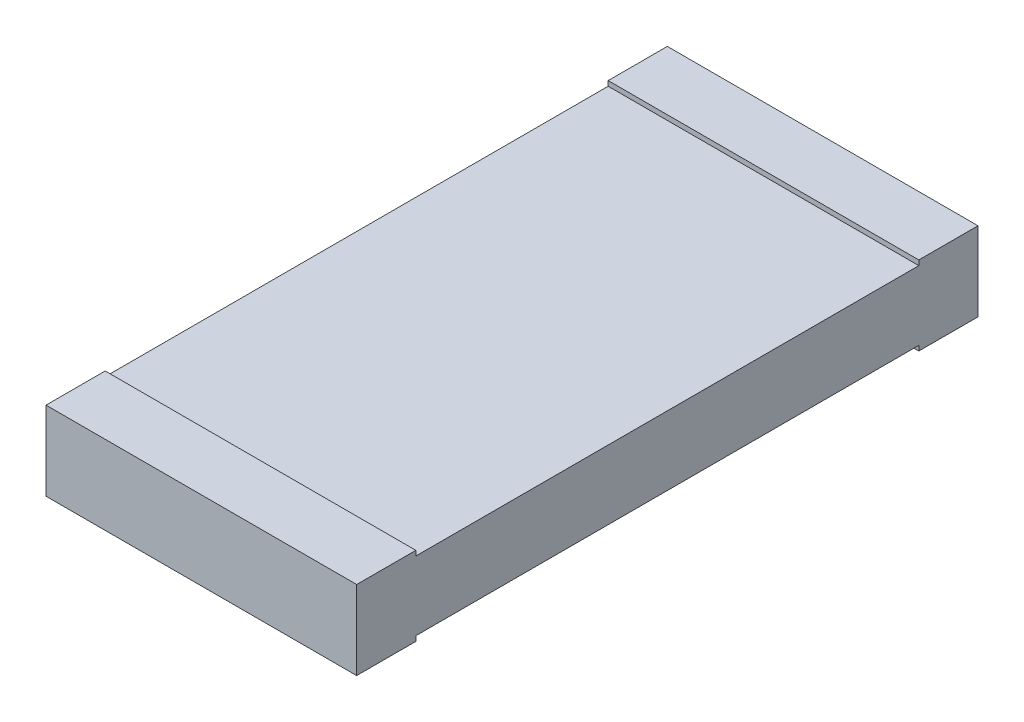
ISO-10303-21;
HEADER;
FILE_DESCRIPTION(('STEP AP214'),'2;1');
FILE_NAME('part.step','',(''),(''),'','','');
FILE_SCHEMA(('AUTOMOTIVE_DESIGN { 1 0 10303 214 1 1 1 1 }'));
ENDSEC;
DATA;
#1=APPLICATION_CONTEXT('core data for automotive mechanical design processes');
#2=APPLICATION_PROTOCOL_DEFINITION('international standard','automotive_design',2000,#1);
#3=PRODUCT_CONTEXT('',#1,'mechanical');
#4=PRODUCT('Part','Part','',(#3));
#5=PRODUCT_RELATED_PRODUCT_CATEGORY('part','',(#4));
#6=PRODUCT_DEFINITION_FORMATION('','',#4);
#7=PRODUCT_DEFINITION_CONTEXT('part definition',#1,'design');
#8=PRODUCT_DEFINITION('design','',#6,#7);
#9=PRODUCT_DEFINITION_SHAPE('','',#8);
#10=(LENGTH_UNIT() NAMED_UNIT(*) SI_UNIT(.MILLI.,.METRE.));
#11=(NAMED_UNIT(*) PLANE_ANGLE_UNIT() SI_UNIT($,.RADIAN.));
#12=(NAMED_UNIT(*) SI_UNIT($,.STERADIAN.) SOLID_ANGLE_UNIT());
#13=UNCERTAINTY_MEASURE_WITH_UNIT(LENGTH_MEASURE(1.E-05),#10,'distance_accuracy_value','');
#14=(GEOMETRIC_REPRESENTATION_CONTEXT(3) GLOBAL_UNCERTAINTY_ASSIGNED_CONTEXT((#13)) GLOBAL_UNIT_ASSIGNED_CONTEXT((#10,
#11,#12)) REPRESENTATION_CONTEXT('',''));
#15=CARTESIAN_POINT('',(0.,0.,0.));
#16=DIRECTION('',(0.,0.,1.));
#17=DIRECTION('',(1.,0.,0.));
#18=AXIS2_PLACEMENT_3D('',#15,#16,#17);
#19=CARTESIAN_POINT('',(-1.575,0.,3.15));
#20=DIRECTION('',(0.,1.,0.));
#21=DIRECTION('',(0.,0.,1.));
#22=AXIS2_PLACEMENT_3D('',#19,#20,#21);
#23=PLANE('',#22);
#24=DIRECTION('',(-1.,0.,0.));
#25=VECTOR('',#24,1.);
#26=CARTESIAN_POINT('',(-1.575,0.,-2.55));
#27=LINE('',#26,#25);
#28=CARTESIAN_POINT('',(1.575,0.,-2.55));
#29=VERTEX_POINT('',#28);
#30=CARTESIAN_POINT('',(-1.575,0.,-2.55));
#31=VERTEX_POINT('',#30);
#32=EDGE_CURVE('E149',#29,#31,#27,.T.);
#33=ORIENTED_EDGE('',*,*,#32,.T.);
#34=DIRECTION('',(0.,0.,1.));
#35=VECTOR('',#34,1.);
#36=CARTESIAN_POINT('',(-1.575,0.,3.15));
#37=LINE('',#36,#35);
#38=CARTESIAN_POINT('',(-1.575,0.,-3.15));
#39=VERTEX_POINT('',#38);
#40=EDGE_CURVE('E20',#39,#31,#37,.T.);
#41=ORIENTED_EDGE('',*,*,#40,.F.);
#42=DIRECTION('',(1.,0.,0.));
#43=VECTOR('',#42,1.);
#44=CARTESIAN_POINT('',(-1.575,0.,-3.15));
#45=LINE('',#44,#43);
#46=CARTESIAN_POINT('',(1.575,0.,-3.15));
#47=VERTEX_POINT('',#46);
#48=EDGE_CURVE('E155',#39,#47,#45,.T.);
#49=ORIENTED_EDGE('',*,*,#48,.T.);
#50=DIRECTION('',(0.,0.,1.));
#51=VECTOR('',#50,1.);
#52=CARTESIAN_POINT('',(1.575,0.,3.15));
#53=LINE('',#52,#51);
#54=EDGE_CURVE('E134',#29,#47,#53,.F.);
#55=ORIENTED_EDGE('',*,*,#54,.F.);
#56=EDGE_LOOP('',(#33,#41,#49,#55));
#57=FACE_BOUND('',#56,.T.);
#58=ADVANCED_FACE('F17',(#57),#23,.F.);
#59=CARTESIAN_POINT('',(-1.575,0.,3.15));
#60=DIRECTION('',(0.,1.,0.));
#61=DIRECTION('',(0.,0.,1.));
#62=AXIS2_PLACEMENT_3D('',#59,#60,#61);
#63=PLANE('',#62);
#64=DIRECTION('',(1.,0.,0.));
#65=VECTOR('',#64,1.);
#66=CARTESIAN_POINT('',(-1.575,0.,2.55));
#67=LINE('',#66,#65);
#68=CARTESIAN_POINT('',(-1.575,0.,2.55));
#69=VERTEX_POINT('',#68);
#70=CARTESIAN_POINT('',(1.575,0.,2.55));
#71=VERTEX_POINT('',#70);
#72=EDGE_CURVE('E160',#69,#71,#67,.T.);
#73=ORIENTED_EDGE('',*,*,#72,.T.);
#74=DIRECTION('',(0.,0.,1.));
#75=VECTOR('',#74,1.);
#76=CARTESIAN_POINT('',(1.575,0.,3.15));
#77=LINE('',#76,#75);
#78=CARTESIAN_POINT('',(1.575,0.,3.15));
#79=VERTEX_POINT('',#78);
#80=EDGE_CURVE('E102',#79,#71,#77,.F.);
#81=ORIENTED_EDGE('',*,*,#80,.F.);
#82=DIRECTION('',(-1.,0.,0.));
#83=VECTOR('',#82,1.);
#84=CARTESIAN_POINT('',(-1.575,0.,3.15));
#85=LINE('',#84,#83);
#86=CARTESIAN_POINT('',(-1.575,0.,3.15));
#87=VERTEX_POINT('',#86);
#88=EDGE_CURVE('E111',#79,#87,#85,.T.);
#89=ORIENTED_EDGE('',*,*,#88,.T.);
#90=DIRECTION('',(0.,0.,1.));
#91=VECTOR('',#90,1.);
#92=CARTESIAN_POINT('',(-1.575,0.,3.15));
#93=LINE('',#92,#91);
#94=EDGE_CURVE('E117',#69,#87,#93,.T.);
#95=ORIENTED_EDGE('',*,*,#94,.F.);
#96=EDGE_LOOP('',(#73,#81,#89,#95));
#97=FACE_BOUND('',#96,.T.);
#98=ADVANCED_FACE('F125',(#97),#63,.F.);
#99=CARTESIAN_POINT('',(-1.575,0.8,3.15));
#100=DIRECTION('',(0.,0.,-1.));
#101=DIRECTION('',(-1.,0.,0.));
#102=AXIS2_PLACEMENT_3D('',#99,#100,#101);
#103=PLANE('',#102);
#104=DIRECTION('',(0.,1.,0.));
#105=VECTOR('',#104,1.);
#106=CARTESIAN_POINT('',(1.575,0.8,3.15));
#107=LINE('',#106,#105);
#108=CARTESIAN_POINT('',(1.575,0.8,3.15));
#109=VERTEX_POINT('',#108);
#110=EDGE_CURVE('E116',#109,#79,#107,.F.);
#111=ORIENTED_EDGE('',*,*,#110,.F.);
#112=DIRECTION('',(1.,0.,0.));
#113=VECTOR('',#112,1.);
#114=CARTESIAN_POINT('',(-1.575,0.8,3.15));
#115=LINE('',#114,#113);
#116=CARTESIAN_POINT('',(-1.575,0.8,3.15));
#117=VERTEX_POINT('',#116);
#118=EDGE_CURVE('E114',#117,#109,#115,.T.);
#119=ORIENTED_EDGE('',*,*,#118,.F.);
#120=DIRECTION('',(0.,1.,0.));
#121=VECTOR('',#120,1.);
#122=CARTESIAN_POINT('',(-1.575,0.8,3.15));
#123=LINE('',#122,#121);
#124=EDGE_CURVE('E108',#87,#117,#123,.T.);
#125=ORIENTED_EDGE('',*,*,#124,.F.);
#126=ORIENTED_EDGE('',*,*,#88,.F.);
#127=EDGE_LOOP('',(#111,#119,#125,#126));
#128=FACE_BOUND('',#127,.T.);
#129=ADVANCED_FACE('F110',(#128),#103,.F.);
#130=CARTESIAN_POINT('',(-1.575,0.8,-3.15));
#131=DIRECTION('',(0.,0.,1.));
#132=DIRECTION('',(1.,0.,0.));
#133=AXIS2_PLACEMENT_3D('',#130,#131,#132);
#134=PLANE('',#133);
#135=DIRECTION('',(0.,1.,0.));
#136=VECTOR('',#135,1.);
#137=CARTESIAN_POINT('',(-1.575,0.8,-3.15));
#138=LINE('',#137,#136);
#139=CARTESIAN_POINT('',(-1.575,0.8,-3.15));
#140=VERTEX_POINT('',#139);
#141=EDGE_CURVE('E129',#140,#39,#138,.F.);
#142=ORIENTED_EDGE('',*,*,#141,.F.);
#143=DIRECTION('',(1.,0.,0.));
#144=VECTOR('',#143,1.);
#145=CARTESIAN_POINT('',(-1.575,0.8,-3.15));
#146=LINE('',#145,#144);
#147=CARTESIAN_POINT('',(1.575,0.8,-3.15));
#148=VERTEX_POINT('',#147);
#149=EDGE_CURVE('E172',#148,#140,#146,.F.);
#150=ORIENTED_EDGE('',*,*,#149,.F.);
#151=DIRECTION('',(0.,1.,0.));
#152=VECTOR('',#151,1.);
#153=CARTESIAN_POINT('',(1.575,0.8,-3.15));
#154=LINE('',#153,#152);
#155=EDGE_CURVE('E126',#47,#148,#154,.T.);
#156=ORIENTED_EDGE('',*,*,#155,.F.);
#157=ORIENTED_EDGE('',*,*,#48,.F.);
#158=EDGE_LOOP('',(#142,#150,#156,#157));
#159=FACE_BOUND('',#158,.T.);
#160=ADVANCED_FACE('F256',(#159),#134,.F.);
#161=CARTESIAN_POINT('',(-1.575,-0.319521140078355,-2.55));
#162=DIRECTION('',(0.,0.,-1.));
#163=DIRECTION('',(-1.,0.,0.));
#164=AXIS2_PLACEMENT_3D('',#161,#162,#163);
#165=PLANE('',#164);
#166=DIRECTION('',(1.,0.,0.));
#167=VECTOR('',#166,1.);
#168=CARTESIAN_POINT('',(-1.575,0.0500000000000006,-2.55));
#169=LINE('',#168,#167);
#170=CARTESIAN_POINT('',(1.575,0.0500000000000007,-2.55));
#171=VERTEX_POINT('',#170);
#172=CARTESIAN_POINT('',(-1.575,0.0500000000000005,-2.55));
#173=VERTEX_POINT('',#172);
#174=EDGE_CURVE('E151',#171,#173,#169,.F.);
#175=ORIENTED_EDGE('',*,*,#174,.T.);
#176=DIRECTION('',(0.,1.,0.));
#177=VECTOR('',#176,1.);
#178=CARTESIAN_POINT('',(-1.575,-0.319521140078355,-2.55));
#179=LINE('',#178,#177);
#180=EDGE_CURVE('E140',#31,#173,#179,.T.);
#181=ORIENTED_EDGE('',*,*,#180,.F.);
#182=ORIENTED_EDGE('',*,*,#32,.F.);
#183=DIRECTION('',(0.,1.,0.));
#184=VECTOR('',#183,1.);
#185=CARTESIAN_POINT('',(1.575,-0.319521140078355,-2.55));
#186=LINE('',#185,#184);
#187=EDGE_CURVE('E153',#171,#29,#186,.F.);
#188=ORIENTED_EDGE('',*,*,#187,.F.);
#189=EDGE_LOOP('',(#175,#181,#182,#188));
#190=FACE_BOUND('',#189,.T.);
#191=ADVANCED_FACE('F148',(#190),#165,.F.);
#192=CARTESIAN_POINT('',(-1.575,-0.319521140078356,2.55));
#193=DIRECTION('',(0.,0.,1.));
#194=DIRECTION('',(1.,0.,0.));
#195=AXIS2_PLACEMENT_3D('',#192,#193,#194);
#196=PLANE('',#195);
#197=DIRECTION('',(1.,0.,0.));
#198=VECTOR('',#197,1.);
#199=CARTESIAN_POINT('',(-1.575,0.05,2.55));
#200=LINE('',#199,#198);
#201=CARTESIAN_POINT('',(-1.575,0.05,2.55));
#202=VERTEX_POINT('',#201);
#203=CARTESIAN_POINT('',(1.575,0.0500000000000002,2.55));
#204=VERTEX_POINT('',#203);
#205=EDGE_CURVE('E176',#202,#204,#200,.T.);
#206=ORIENTED_EDGE('',*,*,#205,.T.);
#207=DIRECTION('',(0.,1.,0.));
#208=VECTOR('',#207,1.);
#209=CARTESIAN_POINT('',(1.575,-0.319521140078356,2.55));
#210=LINE('',#209,#208);
#211=EDGE_CURVE('E162',#71,#204,#210,.T.);
#212=ORIENTED_EDGE('',*,*,#211,.F.);
#213=ORIENTED_EDGE('',*,*,#72,.F.);
#214=DIRECTION('',(0.,1.,0.));
#215=VECTOR('',#214,1.);
#216=CARTESIAN_POINT('',(-1.575,-0.319521140078356,2.55));
#217=LINE('',#216,#215);
#218=EDGE_CURVE('E122',#202,#69,#217,.F.);
#219=ORIENTED_EDGE('',*,*,#218,.F.);
#220=EDGE_LOOP('',(#206,#212,#213,#219));
#221=FACE_BOUND('',#220,.T.);
#222=ADVANCED_FACE('F249',(#221),#196,.F.);
#223=CARTESIAN_POINT('',(-1.575,0.8,3.15));
#224=DIRECTION('',(0.,1.,0.));
#225=DIRECTION('',(0.,0.,1.));
#226=AXIS2_PLACEMENT_3D('',#223,#224,#225);
#227=PLANE('',#226);
#228=ORIENTED_EDGE('',*,*,#118,.T.);
#229=DIRECTION('',(0.,0.,1.));
#230=VECTOR('',#229,1.);
#231=CARTESIAN_POINT('',(1.575,0.8,3.15));
#232=LINE('',#231,#230);
#233=CARTESIAN_POINT('',(1.575,0.8,2.55));
#234=VERTEX_POINT('',#233);
#235=EDGE_CURVE('E168',#109,#234,#232,.F.);
#236=ORIENTED_EDGE('',*,*,#235,.T.);
#237=DIRECTION('',(1.,0.,0.));
#238=VECTOR('',#237,1.);
#239=CARTESIAN_POINT('',(-1.575,0.8,2.55));
#240=LINE('',#239,#238);
#241=CARTESIAN_POINT('',(-1.575,0.8,2.55));
#242=VERTEX_POINT('',#241);
#243=EDGE_CURVE('E179',#234,#242,#240,.F.);
#244=ORIENTED_EDGE('',*,*,#243,.T.);
#245=DIRECTION('',(0.,0.,1.));
#246=VECTOR('',#245,1.);
#247=CARTESIAN_POINT('',(-1.575,0.8,3.15));
#248=LINE('',#247,#246);
#249=EDGE_CURVE('E165',#242,#117,#248,.T.);
#250=ORIENTED_EDGE('',*,*,#249,.T.);
#251=EDGE_LOOP('',(#228,#236,#244,#250));
#252=FACE_BOUND('',#251,.T.);
#253=ADVANCED_FACE('F245',(#252),#227,.T.);
#254=CARTESIAN_POINT('',(-1.575,0.8,3.15));
#255=DIRECTION('',(0.,1.,0.));
#256=DIRECTION('',(0.,0.,1.));
#257=AXIS2_PLACEMENT_3D('',#254,#255,#256);
#258=PLANE('',#257);
#259=ORIENTED_EDGE('',*,*,#149,.T.);
#260=DIRECTION('',(0.,0.,-1.));
#261=VECTOR('',#260,1.);
#262=CARTESIAN_POINT('',(-1.575,0.8,-3.15));
#263=LINE('',#262,#261);
#264=CARTESIAN_POINT('',(-1.575,0.8,-2.55));
#265=VERTEX_POINT('',#264);
#266=EDGE_CURVE('E182',#140,#265,#263,.F.);
#267=ORIENTED_EDGE('',*,*,#266,.T.);
#268=DIRECTION('',(-1.,0.,0.));
#269=VECTOR('',#268,1.);
#270=CARTESIAN_POINT('',(-1.575,0.8,-2.55));
#271=LINE('',#270,#269);
#272=CARTESIAN_POINT('',(1.575,0.8,-2.55));
#273=VERTEX_POINT('',#272);
#274=EDGE_CURVE('E192',#265,#273,#271,.F.);
#275=ORIENTED_EDGE('',*,*,#274,.T.);
#276=DIRECTION('',(0.,0.,1.));
#277=VECTOR('',#276,1.);
#278=CARTESIAN_POINT('',(1.575,0.8,3.15));
#279=LINE('',#278,#277);
#280=EDGE_CURVE('E170',#273,#148,#279,.F.);
#281=ORIENTED_EDGE('',*,*,#280,.T.);
#282=EDGE_LOOP('',(#259,#267,#275,#281));
#283=FACE_BOUND('',#282,.T.);
#284=ADVANCED_FACE('F241',(#283),#258,.T.);
#285=CARTESIAN_POINT('',(-1.575,0.05,2.55));
#286=DIRECTION('',(0.,1.,0.));
#287=DIRECTION('',(0.,0.,1.));
#288=AXIS2_PLACEMENT_3D('',#285,#286,#287);
#289=PLANE('',#288);
#290=ORIENTED_EDGE('',*,*,#205,.F.);
#291=DIRECTION('',(0.,0.,-1.));
#292=VECTOR('',#291,1.);
#293=CARTESIAN_POINT('',(-1.575,0.05,-3.15));
#294=LINE('',#293,#292);
#295=EDGE_CURVE('E187',#202,#173,#294,.T.);
#296=ORIENTED_EDGE('',*,*,#295,.T.);
#297=ORIENTED_EDGE('',*,*,#174,.F.);
#298=DIRECTION('',(0.,0.,1.));
#299=VECTOR('',#298,1.);
#300=CARTESIAN_POINT('',(1.575,0.0500000000000007,-3.15));
#301=LINE('',#300,#299);
#302=EDGE_CURVE('E199',#171,#204,#301,.T.);
#303=ORIENTED_EDGE('',*,*,#302,.T.);
#304=EDGE_LOOP('',(#290,#296,#297,#303));
#305=FACE_BOUND('',#304,.T.);
#306=ADVANCED_FACE('F238',(#305),#289,.F.);
#307=CARTESIAN_POINT('',(-1.575,1.11952114007836,2.55));
#308=DIRECTION('',(0.,0.,1.));
#309=DIRECTION('',(1.,0.,0.));
#310=AXIS2_PLACEMENT_3D('',#307,#308,#309);
#311=PLANE('',#310);
#312=DIRECTION('',(0.,1.,0.));
#313=VECTOR('',#312,1.);
#314=CARTESIAN_POINT('',(1.575,0.8,2.55));
#315=LINE('',#314,#313);
#316=CARTESIAN_POINT('',(1.575,0.75,2.55));
#317=VERTEX_POINT('',#316);
#318=EDGE_CURVE('E195',#234,#317,#315,.F.);
#319=ORIENTED_EDGE('',*,*,#318,.T.);
#320=DIRECTION('',(1.,0.,0.));
#321=VECTOR('',#320,1.);
#322=CARTESIAN_POINT('',(-1.575,0.75,2.55));
#323=LINE('',#322,#321);
#324=CARTESIAN_POINT('',(-1.575,0.75,2.55));
#325=VERTEX_POINT('',#324);
#326=EDGE_CURVE('E202',#317,#325,#323,.F.);
#327=ORIENTED_EDGE('',*,*,#326,.T.);
#328=DIRECTION('',(0.,1.,0.));
#329=VECTOR('',#328,1.);
#330=CARTESIAN_POINT('',(-1.575,0.8,2.55));
#331=LINE('',#330,#329);
#332=EDGE_CURVE('E184',#325,#242,#331,.T.);
#333=ORIENTED_EDGE('',*,*,#332,.T.);
#334=ORIENTED_EDGE('',*,*,#243,.F.);
#335=EDGE_LOOP('',(#319,#327,#333,#334));
#336=FACE_BOUND('',#335,.T.);
#337=ADVANCED_FACE('F218',(#336),#311,.F.);
#338=CARTESIAN_POINT('',(-1.575,0.8,-3.15));
#339=DIRECTION('',(1.,0.,0.));
#340=DIRECTION('',(0.,0.,-1.));
#341=AXIS2_PLACEMENT_3D('',#338,#339,#340);
#342=PLANE('',#341);
#343=ORIENTED_EDGE('',*,*,#218,.T.);
#344=ORIENTED_EDGE('',*,*,#94,.T.);
#345=ORIENTED_EDGE('',*,*,#124,.T.);
#346=ORIENTED_EDGE('',*,*,#249,.F.);
#347=ORIENTED_EDGE('',*,*,#332,.F.);
#348=DIRECTION('',(0.,0.,-1.));
#349=VECTOR('',#348,1.);
#350=CARTESIAN_POINT('',(-1.575,0.75,2.55));
#351=LINE('',#350,#349);
#352=CARTESIAN_POINT('',(-1.575,0.750000000000001,-2.55));
#353=VERTEX_POINT('',#352);
#354=EDGE_CURVE('E205',#325,#353,#351,.T.);
#355=ORIENTED_EDGE('',*,*,#354,.T.);
#356=DIRECTION('',(0.,1.,0.));
#357=VECTOR('',#356,1.);
#358=CARTESIAN_POINT('',(-1.575,1.11952114007836,-2.55));
#359=LINE('',#358,#357);
#360=EDGE_CURVE('E189',#353,#265,#359,.T.);
#361=ORIENTED_EDGE('',*,*,#360,.T.);
#362=ORIENTED_EDGE('',*,*,#266,.F.);
#363=ORIENTED_EDGE('',*,*,#141,.T.);
#364=ORIENTED_EDGE('',*,*,#40,.T.);
#365=ORIENTED_EDGE('',*,*,#180,.T.);
#366=ORIENTED_EDGE('',*,*,#295,.F.);
#367=EDGE_LOOP('',(#343,#344,#345,#346,#347,#355,#361,#362,#363,#364,#365,#366));
#368=FACE_BOUND('',#367,.T.);
#369=ADVANCED_FACE('F120',(#368),#342,.F.);
#370=CARTESIAN_POINT('',(-1.575,1.11952114007836,-2.55));
#371=DIRECTION('',(0.,0.,-1.));
#372=DIRECTION('',(-1.,0.,0.));
#373=AXIS2_PLACEMENT_3D('',#370,#371,#372);
#374=PLANE('',#373);
#375=ORIENTED_EDGE('',*,*,#360,.F.);
#376=DIRECTION('',(1.,0.,0.));
#377=VECTOR('',#376,1.);
#378=CARTESIAN_POINT('',(-1.575,0.750000000000001,-2.55));
#379=LINE('',#378,#377);
#380=CARTESIAN_POINT('',(1.575,0.75,-2.55));
#381=VERTEX_POINT('',#380);
#382=EDGE_CURVE('E26',#353,#381,#379,.T.);
#383=ORIENTED_EDGE('',*,*,#382,.T.);
#384=DIRECTION('',(0.,1.,0.));
#385=VECTOR('',#384,1.);
#386=CARTESIAN_POINT('',(1.575,0.8,-2.55));
#387=LINE('',#386,#385);
#388=EDGE_CURVE('E34',#381,#273,#387,.T.);
#389=ORIENTED_EDGE('',*,*,#388,.T.);
#390=ORIENTED_EDGE('',*,*,#274,.F.);
#391=EDGE_LOOP('',(#375,#383,#389,#390));
#392=FACE_BOUND('',#391,.T.);
#393=ADVANCED_FACE('F211',(#392),#374,.F.);
#394=CARTESIAN_POINT('',(1.575,0.8,-3.15));
#395=DIRECTION('',(-1.,0.,0.));
#396=DIRECTION('',(0.,0.,1.));
#397=AXIS2_PLACEMENT_3D('',#394,#395,#396);
#398=PLANE('',#397);
#399=ORIENTED_EDGE('',*,*,#211,.T.);
#400=ORIENTED_EDGE('',*,*,#302,.F.);
#401=ORIENTED_EDGE('',*,*,#187,.T.);
#402=ORIENTED_EDGE('',*,*,#54,.T.);
#403=ORIENTED_EDGE('',*,*,#155,.T.);
#404=ORIENTED_EDGE('',*,*,#280,.F.);
#405=ORIENTED_EDGE('',*,*,#388,.F.);
#406=DIRECTION('',(0.,0.,-1.));
#407=VECTOR('',#406,1.);
#408=CARTESIAN_POINT('',(1.575,0.75,2.55));
#409=LINE('',#408,#407);
#410=EDGE_CURVE('E11',#381,#317,#409,.F.);
#411=ORIENTED_EDGE('',*,*,#410,.T.);
#412=ORIENTED_EDGE('',*,*,#318,.F.);
#413=ORIENTED_EDGE('',*,*,#235,.F.);
#414=ORIENTED_EDGE('',*,*,#110,.T.);
#415=ORIENTED_EDGE('',*,*,#80,.T.);
#416=EDGE_LOOP('',(#399,#400,#401,#402,#403,#404,#405,#411,#412,#413,#414,#415));
#417=FACE_BOUND('',#416,.T.);
#418=ADVANCED_FACE('F221',(#417),#398,.F.);
#419=CARTESIAN_POINT('',(-1.575,0.75,2.55));
#420=DIRECTION('',(0.,-1.,0.));
#421=DIRECTION('',(0.,0.,-1.));
#422=AXIS2_PLACEMENT_3D('',#419,#420,#421);
#423=PLANE('',#422);
#424=ORIENTED_EDGE('',*,*,#382,.F.);
#425=ORIENTED_EDGE('',*,*,#354,.F.);
#426=ORIENTED_EDGE('',*,*,#326,.F.);
#427=ORIENTED_EDGE('',*,*,#410,.F.);
#428=EDGE_LOOP('',(#424,#425,#426,#427));
#429=FACE_BOUND('',#428,.T.);
#430=ADVANCED_FACE('F215',(#429),#423,.F.);
#431=CLOSED_SHELL('',(#58,#98,#129,#160,#191,#222,#253,#284,#306,#337,#369,#393,#418,#430));
#432=MANIFOLD_SOLID_BREP('B1',#431);
#433=ADVANCED_BREP_SHAPE_REPRESENTATION('',(#18,#432),#14);
#434=SHAPE_DEFINITION_REPRESENTATION(#9,#433);
ENDSEC;
END-ISO-10303-21;
